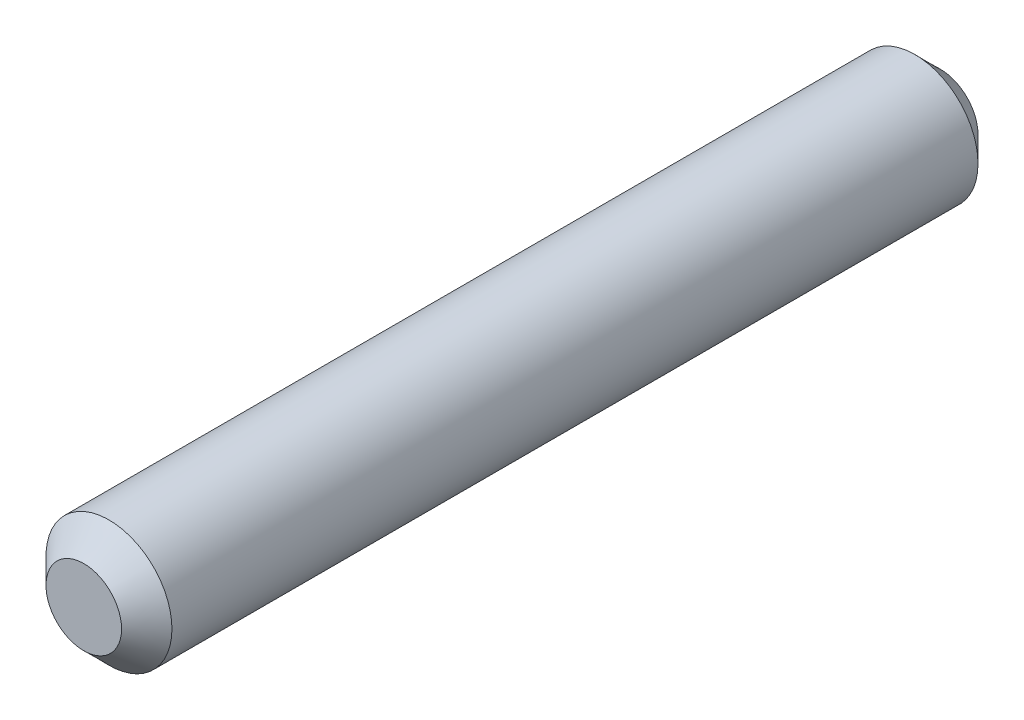
ISO-10303-21;
HEADER;
FILE_DESCRIPTION(('STEP AP214'),'2;1');
FILE_NAME('part.step','',(''),(''),'','','');
FILE_SCHEMA(('AUTOMOTIVE_DESIGN { 1 0 10303 214 1 1 1 1 }'));
ENDSEC;
DATA;
#1=APPLICATION_CONTEXT('core data for automotive mechanical design processes');
#2=APPLICATION_PROTOCOL_DEFINITION('international standard','automotive_design',2000,#1);
#3=PRODUCT_CONTEXT('',#1,'mechanical');
#4=PRODUCT('Part','Part','',(#3));
#5=PRODUCT_RELATED_PRODUCT_CATEGORY('part','',(#4));
#6=PRODUCT_DEFINITION_FORMATION('','',#4);
#7=PRODUCT_DEFINITION_CONTEXT('part definition',#1,'design');
#8=PRODUCT_DEFINITION('design','',#6,#7);
#9=PRODUCT_DEFINITION_SHAPE('','',#8);
#10=(LENGTH_UNIT() NAMED_UNIT(*) SI_UNIT(.MILLI.,.METRE.));
#11=(NAMED_UNIT(*) PLANE_ANGLE_UNIT() SI_UNIT($,.RADIAN.));
#12=(NAMED_UNIT(*) SI_UNIT($,.STERADIAN.) SOLID_ANGLE_UNIT());
#13=UNCERTAINTY_MEASURE_WITH_UNIT(LENGTH_MEASURE(1.E-05),#10,'distance_accuracy_value','');
#14=(GEOMETRIC_REPRESENTATION_CONTEXT(3) GLOBAL_UNCERTAINTY_ASSIGNED_CONTEXT((#13)) GLOBAL_UNIT_ASSIGNED_CONTEXT((#10,
#11,#12)) REPRESENTATION_CONTEXT('',''));
#15=CARTESIAN_POINT('',(0.,0.,0.));
#16=DIRECTION('',(0.,0.,1.));
#17=DIRECTION('',(1.,0.,0.));
#18=AXIS2_PLACEMENT_3D('',#15,#16,#17);
#19=CARTESIAN_POINT('',(0.,0.,21.59));
#20=DIRECTION('',(0.,0.,-1.));
#21=DIRECTION('',(-1.,0.,0.));
#22=AXIS2_PLACEMENT_3D('',#19,#20,#21);
#23=CYLINDRICAL_SURFACE('',#22,1.5875);
#24=CARTESIAN_POINT('',(0.,0.,0.634999999999997));
#25=DIRECTION('',(0.,0.,1.));
#26=DIRECTION('',(1.,0.,0.));
#27=AXIS2_PLACEMENT_3D('',#24,#25,#26);
#28=CIRCLE('',#27,1.5875);
#29=CARTESIAN_POINT('',(1.5875,0.,0.634999999999997));
#30=VERTEX_POINT('',#29);
#31=EDGE_CURVE('E41',#30,#30,#28,.T.);
#32=ORIENTED_EDGE('',*,*,#31,.T.);
#33=EDGE_LOOP('',(#32));
#34=FACE_BOUND('',#33,.T.);
#35=CARTESIAN_POINT('',(0.,0.,20.955));
#36=DIRECTION('',(0.,0.,1.));
#37=DIRECTION('',(1.,0.,0.));
#38=AXIS2_PLACEMENT_3D('',#35,#36,#37);
#39=CIRCLE('',#38,1.5875);
#40=CARTESIAN_POINT('',(1.5875,0.,20.955));
#41=VERTEX_POINT('',#40);
#42=EDGE_CURVE('E45',#41,#41,#39,.F.);
#43=ORIENTED_EDGE('',*,*,#42,.T.);
#44=EDGE_LOOP('',(#43));
#45=FACE_BOUND('',#44,.T.);
#46=ADVANCED_FACE('F30',(#34,#45),#23,.T.);
#47=CARTESIAN_POINT('',(0.,0.,21.59));
#48=DIRECTION('',(0.,0.,1.));
#49=DIRECTION('',(1.,0.,0.));
#50=AXIS2_PLACEMENT_3D('',#47,#48,#49);
#51=PLANE('',#50);
#52=CARTESIAN_POINT('',(0.,0.,21.59));
#53=DIRECTION('',(0.,0.,1.));
#54=DIRECTION('',(1.,0.,0.));
#55=AXIS2_PLACEMENT_3D('',#52,#53,#54);
#56=CIRCLE('',#55,0.952499999999998);
#57=CARTESIAN_POINT('',(0.952499999999998,0.,21.59));
#58=VERTEX_POINT('',#57);
#59=EDGE_CURVE('E10',#58,#58,#56,.T.);
#60=ORIENTED_EDGE('',*,*,#59,.T.);
#61=EDGE_LOOP('',(#60));
#62=FACE_BOUND('',#61,.T.);
#63=ADVANCED_FACE('F61',(#62),#51,.T.);
#64=CARTESIAN_POINT('',(0.,0.,0.));
#65=DIRECTION('',(0.,0.,1.));
#66=DIRECTION('',(1.,0.,0.));
#67=AXIS2_PLACEMENT_3D('',#64,#65,#66);
#68=PLANE('',#67);
#69=CARTESIAN_POINT('',(0.,0.,0.));
#70=DIRECTION('',(0.,0.,1.));
#71=DIRECTION('',(1.,0.,0.));
#72=AXIS2_PLACEMENT_3D('',#69,#70,#71);
#73=CIRCLE('',#72,0.9525);
#74=CARTESIAN_POINT('',(0.9525,0.,0.));
#75=VERTEX_POINT('',#74);
#76=EDGE_CURVE('E37',#75,#75,#73,.F.);
#77=ORIENTED_EDGE('',*,*,#76,.T.);
#78=EDGE_LOOP('',(#77));
#79=FACE_BOUND('',#78,.T.);
#80=ADVANCED_FACE('F58',(#79),#68,.F.);
#81=CARTESIAN_POINT('',(0.,0.,0.634999999999997));
#82=DIRECTION('',(0.,0.,1.));
#83=DIRECTION('',(1.,0.,0.));
#84=AXIS2_PLACEMENT_3D('',#81,#82,#83);
#85=CONICAL_SURFACE('',#84,1.5875,0.785398163397451);
#86=ORIENTED_EDGE('',*,*,#76,.F.);
#87=EDGE_LOOP('',(#86));
#88=FACE_BOUND('',#87,.T.);
#89=ORIENTED_EDGE('',*,*,#31,.F.);
#90=EDGE_LOOP('',(#89));
#91=FACE_BOUND('',#90,.T.);
#92=ADVANCED_FACE('F54',(#88,#91),#85,.T.);
#93=CARTESIAN_POINT('',(0.,0.,21.59));
#94=DIRECTION('',(0.,0.,-1.));
#95=DIRECTION('',(-1.,0.,0.));
#96=AXIS2_PLACEMENT_3D('',#93,#94,#95);
#97=CONICAL_SURFACE('',#96,0.952499999999998,0.785398163397447);
#98=ORIENTED_EDGE('',*,*,#42,.F.);
#99=EDGE_LOOP('',(#98));
#100=FACE_BOUND('',#99,.T.);
#101=ORIENTED_EDGE('',*,*,#59,.F.);
#102=EDGE_LOOP('',(#101));
#103=FACE_BOUND('',#102,.T.);
#104=ADVANCED_FACE('F32',(#100,#103),#97,.T.);
#105=CLOSED_SHELL('',(#46,#63,#80,#92,#104));
#106=MANIFOLD_SOLID_BREP('B2',#105);
#107=ADVANCED_BREP_SHAPE_REPRESENTATION('',(#18,#106),#14);
#108=SHAPE_DEFINITION_REPRESENTATION(#9,#107);
ENDSEC;
END-ISO-10303-21;
